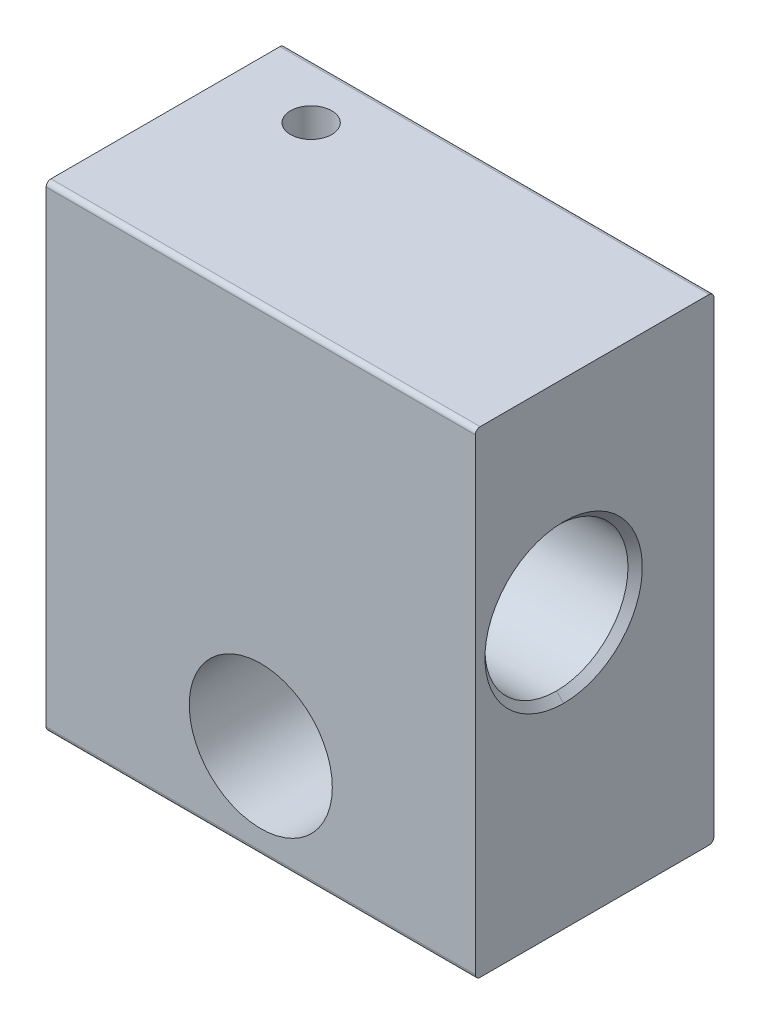
ISO-10303-21;
HEADER;
FILE_DESCRIPTION(('STEP AP214'),'2;1');
FILE_NAME('part.step','',(''),(''),'','','');
FILE_SCHEMA(('AUTOMOTIVE_DESIGN { 1 0 10303 214 1 1 1 1 }'));
ENDSEC;
DATA;
#1=APPLICATION_CONTEXT('core data for automotive mechanical design processes');
#2=APPLICATION_PROTOCOL_DEFINITION('international standard','automotive_design',2000,#1);
#3=PRODUCT_CONTEXT('',#1,'mechanical');
#4=PRODUCT('Part','Part','',(#3));
#5=PRODUCT_RELATED_PRODUCT_CATEGORY('part','',(#4));
#6=PRODUCT_DEFINITION_FORMATION('','',#4);
#7=PRODUCT_DEFINITION_CONTEXT('part definition',#1,'design');
#8=PRODUCT_DEFINITION('design','',#6,#7);
#9=PRODUCT_DEFINITION_SHAPE('','',#8);
#10=(LENGTH_UNIT() NAMED_UNIT(*) SI_UNIT(.MILLI.,.METRE.));
#11=(NAMED_UNIT(*) PLANE_ANGLE_UNIT() SI_UNIT($,.RADIAN.));
#12=(NAMED_UNIT(*) SI_UNIT($,.STERADIAN.) SOLID_ANGLE_UNIT());
#13=UNCERTAINTY_MEASURE_WITH_UNIT(LENGTH_MEASURE(1.E-05),#10,'distance_accuracy_value','');
#14=(GEOMETRIC_REPRESENTATION_CONTEXT(3) GLOBAL_UNCERTAINTY_ASSIGNED_CONTEXT((#13)) GLOBAL_UNIT_ASSIGNED_CONTEXT((#10,
#11,#12)) REPRESENTATION_CONTEXT('',''));
#15=CARTESIAN_POINT('',(0.,0.,0.));
#16=DIRECTION('',(0.,0.,1.));
#17=DIRECTION('',(1.,0.,0.));
#18=AXIS2_PLACEMENT_3D('',#15,#16,#17);
#19=CARTESIAN_POINT('',(0.,0.,0.));
#20=DIRECTION('',(-1.,0.,0.));
#21=DIRECTION('',(0.,0.,1.));
#22=AXIS2_PLACEMENT_3D('',#19,#20,#21);
#23=PLANE('',#22);
#24=CARTESIAN_POINT('',(0.,4.75,-2.75));
#25=DIRECTION('',(-1.,0.,0.));
#26=DIRECTION('',(0.,0.,1.));
#27=AXIS2_PLACEMENT_3D('',#24,#25,#26);
#28=CIRCLE('',#27,1.75);
#29=CARTESIAN_POINT('',(0.,4.75,-1.));
#30=VERTEX_POINT('',#29);
#31=EDGE_CURVE('E27',#30,#30,#28,.T.);
#32=ORIENTED_EDGE('',*,*,#31,.T.);
#33=EDGE_LOOP('',(#32));
#34=FACE_BOUND('',#33,.T.);
#35=ADVANCED_FACE('F24',(#34),#23,.T.);
#36=CARTESIAN_POINT('',(-5.58374404907,8.5,-2.69599699974));
#37=DIRECTION('',(0.,1.,0.));
#38=DIRECTION('',(0.,0.,1.));
#39=AXIS2_PLACEMENT_3D('',#36,#37,#38);
#40=CYLINDRICAL_SURFACE('',#39,0.865463381036);
#41=CARTESIAN_POINT('',(-5.58374404907,10.,-2.69599699974));
#42=DIRECTION('',(0.,1.,0.));
#43=DIRECTION('',(0.,0.,1.));
#44=AXIS2_PLACEMENT_3D('',#41,#42,#43);
#45=CIRCLE('',#44,0.865463381036);
#46=CARTESIAN_POINT('',(-5.58374404907,10.,-1.830533618704));
#47=VERTEX_POINT('',#46);
#48=EDGE_CURVE('E315',#47,#47,#45,.F.);
#49=ORIENTED_EDGE('',*,*,#48,.F.);
#50=EDGE_LOOP('',(#49));
#51=FACE_BOUND('',#50,.T.);
#52=CARTESIAN_POINT('',(-6.449207430106,6.49916656610024,-2.69599699973999));
#53=CARTESIAN_POINT('',(-6.4492086873096,6.49972354637153,-2.71400541937037));
#54=CARTESIAN_POINT('',(-6.44864705794048,6.50000139105537,-2.73201531789425));
#55=CARTESIAN_POINT('',(-6.44465669121742,6.49999646183324,-2.79574426413716));
#56=CARTESIAN_POINT('',(-6.43814057995364,6.49818642035229,-2.84132539176675));
#57=CARTESIAN_POINT('',(-6.4180382537288,6.49122571648187,-2.93070952830053));
#58=CARTESIAN_POINT('',(-6.40443358886115,6.48606632783735,-2.97450757396934));
#59=CARTESIAN_POINT('',(-6.37075997097261,6.47305113628228,-3.05888384176469));
#60=CARTESIAN_POINT('',(-6.35071841834362,6.46520675365258,-3.09947481905903));
#61=CARTESIAN_POINT('',(-6.3048151199277,6.44763759692892,-3.17672968859697));
#62=CARTESIAN_POINT('',(-6.27895486317882,6.43791330400374,-3.21339458201017));
#63=CARTESIAN_POINT('',(-6.2203272749571,6.41689392028393,-3.28423923717417));
#64=CARTESIAN_POINT('',(-6.18723607882171,6.40553932282132,-3.31813326780307));
#65=CARTESIAN_POINT('',(-6.11593727697109,6.38295228004643,-3.38012504391386));
#66=CARTESIAN_POINT('',(-6.07772629947583,6.37171992055383,-3.40821893830059));
#67=CARTESIAN_POINT('',(-5.99463932902142,6.35004468851422,-3.45934652718211));
#68=CARTESIAN_POINT('',(-5.94950847478227,6.3396825131614,-3.48200369915722));
#69=CARTESIAN_POINT('',(-5.85548109889723,6.32200273379749,-3.51924457908662));
#70=CARTESIAN_POINT('',(-5.80658803205411,6.31468237514228,-3.53383559565921));
#71=CARTESIAN_POINT('',(-5.71015822828295,6.30467761091631,-3.55348721920538));
#72=CARTESIAN_POINT('',(-5.66277773086278,6.30169709245857,-3.55915894210042));
#73=CARTESIAN_POINT('',(-5.56766096640759,6.29989018264465,-3.56261674312619));
#74=CARTESIAN_POINT('',(-5.51992488675015,6.30106173920841,-3.56040671665055));
#75=CARTESIAN_POINT('',(-5.42986568744132,6.30707872647427,-3.5487744480056));
#76=CARTESIAN_POINT('',(-5.38743385549059,6.31159446122974,-3.53999874988904));
#77=CARTESIAN_POINT('',(-5.30469374898141,6.32332492258392,-3.51636896284278));
#78=CARTESIAN_POINT('',(-5.26438613360283,6.33054048142203,-3.50151299949669));
#79=CARTESIAN_POINT('',(-5.18478837876821,6.34725486800054,-3.46532627941122));
#80=CARTESIAN_POINT('',(-5.14564892915387,6.35684952476926,-3.4437098667129));
#81=CARTESIAN_POINT('',(-5.07132571551039,6.37706212279255,-3.3948772448417));
#82=CARTESIAN_POINT('',(-5.03614366297519,6.38768050312814,-3.36765862711932));
#83=CARTESIAN_POINT('',(-4.9669215117072,6.41000786574007,-3.3050569640343));
#84=CARTESIAN_POINT('',(-4.93337998149943,6.42171551782124,-3.2691194291736));
#85=CARTESIAN_POINT('',(-4.87267220418854,6.44379120867714,-3.19179912856174));
#86=CARTESIAN_POINT('',(-4.84550965627911,6.45415846859545,-3.1504132248832));
#87=CARTESIAN_POINT('',(-4.79838903557011,6.47235511410542,-3.06303241331348));
#88=CARTESIAN_POINT('',(-4.7784520308393,6.48017707149831,-3.01702451902662));
#89=CARTESIAN_POINT('',(-4.74679327213,6.49219025016628,-2.92191200474589));
#90=CARTESIAN_POINT('',(-4.7350468363424,6.4963923886467,-2.87281717881534));
#91=CARTESIAN_POINT('',(-4.72406027310477,6.49948830911025,-2.79882395768014));
#92=CARTESIAN_POINT('',(-4.72149554021143,6.49999977476995,-2.77444274951363));
#93=CARTESIAN_POINT('',(-4.71884295055461,6.50000016566553,-2.73202139985759));
#94=CARTESIAN_POINT('',(-4.71827943330949,6.49972374110849,-2.71400950474476));
#95=CARTESIAN_POINT('',(-4.71828381562203,6.49774620279394,-2.65007910897877));
#96=CARTESIAN_POINT('',(-4.72195702508557,6.49450137214108,-2.60415725481187));
#97=CARTESIAN_POINT('',(-4.73644015740359,6.48458127484062,-2.51376423916476));
#98=CARTESIAN_POINT('',(-4.74726808507634,6.47789736317569,-2.46929703536373));
#99=CARTESIAN_POINT('',(-4.77548993597744,6.46170199844034,-2.38328017681597));
#100=CARTESIAN_POINT('',(-4.79285501221056,6.45220300632357,-2.34171864176206));
#101=CARTESIAN_POINT('',(-4.83350841155483,6.43114763987285,-2.26221305522438));
#102=CARTESIAN_POINT('',(-4.85679511155554,6.41959182957048,-2.22426801637502));
#103=CARTESIAN_POINT('',(-4.91039960167581,6.39450766537549,-2.15023171531711));
#104=CARTESIAN_POINT('',(-4.94108228062547,6.380899206744,-2.11443206004765));
#105=CARTESIAN_POINT('',(-5.00782665576707,6.35354346777814,-2.04826446271212));
#106=CARTESIAN_POINT('',(-5.04389314897671,6.33979607394053,-2.01790141831863));
#107=CARTESIAN_POINT('',(-5.12366652363538,6.31248490389022,-1.96120088078699));
#108=CARTESIAN_POINT('',(-5.16774344408427,6.29901211133435,-1.93533564998294));
#109=CARTESIAN_POINT('',(-5.26045629542931,6.27518576666964,-1.89155126372133));
#110=CARTESIAN_POINT('',(-5.3090877619739,6.26482920114828,-1.87362442382016));
#111=CARTESIAN_POINT('',(-5.40572708885063,6.24950919654306,-1.84767804862572));
#112=CARTESIAN_POINT('',(-5.45350314083801,6.24419665695144,-1.83901090447264));
#113=CARTESIAN_POINT('',(-5.55010384436479,6.23856429273418,-1.82983178166885));
#114=CARTESIAN_POINT('',(-5.59892733496616,6.23823920025186,-1.82931119842093));
#115=CARTESIAN_POINT('',(-5.68934206548476,6.24232890622555,-1.83596382915768));
#116=CARTESIAN_POINT('',(-5.73104107267388,6.24612685707844,-1.84213565272858));
#117=CARTESIAN_POINT('',(-5.8126974348522,6.25700997842461,-1.86031903512794));
#118=CARTESIAN_POINT('',(-5.85265416760186,6.26409631298763,-1.87233266199479));
#119=CARTESIAN_POINT('',(-5.93113878099246,6.2810079361542,-1.9021702391697));
#120=CARTESIAN_POINT('',(-5.96958678335483,6.29090964927711,-1.92015908088539));
#121=CARTESIAN_POINT('',(-6.04310844083208,6.31236402099279,-1.96129449500525));
#122=CARTESIAN_POINT('',(-6.07818061432558,6.32391739900807,-1.98444331743356));
#123=CARTESIAN_POINT('',(-6.14916349491693,6.3493909397552,-2.03903051276998));
#124=CARTESIAN_POINT('',(-6.18449365286089,6.36341497727178,-2.07117778407229));
#125=CARTESIAN_POINT('',(-6.24950164826755,6.39102876469068,-2.14095734186772));
#126=CARTESIAN_POINT('',(-6.27917547390777,6.40461820070326,-2.17859348826337));
#127=CARTESIAN_POINT('',(-6.33367308009541,6.43088241104561,-2.26100960973501));
#128=CARTESIAN_POINT('',(-6.35811108851098,6.44345702275217,-2.30607886074583));
#129=CARTESIAN_POINT('',(-6.39880228118033,6.46541898184203,-2.40047017795097));
#130=CARTESIAN_POINT('',(-6.41506809904862,6.47481124154549,-2.44978554083436));
#131=CARTESIAN_POINT('',(-6.43421838383054,6.48670749743439,-2.53229912888511));
#132=CARTESIAN_POINT('',(-6.4398271574966,6.49047435088954,-2.56470946175158));
#133=CARTESIAN_POINT('',(-6.44731702408066,6.49619244071428,-2.63007797731129));
#134=CARTESIAN_POINT('',(-6.449205128964,6.49814708867279,-2.66303501120335));
#135=CARTESIAN_POINT('',(-6.449207430106,6.49916656610024,-2.69599699973999));
#136=B_SPLINE_CURVE_WITH_KNOTS('',3,(#52,#53,#54,#55,#56,#57,#58,#59,#60,#61,#62,#63,#64,#65,
#66,#67,#68,#69,#70,#71,#72,#73,#74,#75,#76,#77,#78,#79,#80,#81,#82,#83,#84,#85,#86,#87,#88,#89,
#90,#91,#92,#93,#94,#95,#96,#97,#98,#99,#100,#101,#102,#103,#104,#105,#106,#107,#108,#109,#110,
#111,#112,#113,#114,#115,#116,#117,#118,#119,#120,#121,#122,#123,#124,#125,#126,#127,#128,#129,
#130,#131,#132,#133,#134,#135),.UNSPECIFIED.,.T.,.F.,(4,2,2,2,2,2,2,2,2,2,2,2,2,2,2,2,2,2,2,2,2,
2,2,2,2,2,2,2,2,2,2,2,2,2,2,2,2,2,2,2,2,4),(0.,0.0540357553285561,0.191476375635961,
0.329276523182381,0.466497692359897,0.60368378575125,0.74919296440193,0.894798447722468,
1.04864722853286,1.20235637990724,1.3449867549427,1.48754664759974,1.61765966625642,
1.7478128262369,1.88444903710158,2.02114411498192,2.17204378232469,2.32303074200388,
2.47445446976672,2.6254198954768,2.69888403738886,2.75291979271804,2.89066897917203,
3.0287661378322,3.16626091463035,3.30371804481079,3.45032659432867,3.59706656158034,
3.75480439493193,3.91238920086785,4.05803704839619,4.20353104870417,4.3299184228481,
4.45635057159712,4.58661033582154,4.71692701168544,4.86564009999022,5.01445827556282,
5.17199113310592,5.3292797010853,5.42837180708747,5.52727698501349),.UNSPECIFIED.);
#137=CARTESIAN_POINT('',(-6.449207430106,6.49916656610024,-2.69599699973999));
#138=VERTEX_POINT('',#137);
#139=EDGE_CURVE('E351',#138,#138,#136,.T.);
#140=ORIENTED_EDGE('',*,*,#139,.T.);
#141=EDGE_LOOP('',(#140));
#142=FACE_BOUND('',#141,.T.);
#143=ADVANCED_FACE('F357',(#51,#142),#40,.F.);
#144=CARTESIAN_POINT('',(-4.5,4.75,-2.75));
#145=DIRECTION('',(-1.,0.,0.));
#146=DIRECTION('',(0.,0.,1.));
#147=AXIS2_PLACEMENT_3D('',#144,#145,#146);
#148=CYLINDRICAL_SURFACE('',#147,1.75);
#149=ORIENTED_EDGE('',*,*,#31,.F.);
#150=EDGE_LOOP('',(#149));
#151=FACE_BOUND('',#150,.T.);
#152=CARTESIAN_POINT('',(-8.80000000006476,4.75,-2.74999999999999));
#153=DIRECTION('',(-1.,0.,0.));
#154=DIRECTION('',(0.,-1.,0.));
#155=AXIS2_PLACEMENT_3D('',#152,#153,#154);
#156=CIRCLE('',#155,1.74999999995725);
#157=CARTESIAN_POINT('',(-8.80000000003436,6.49999999996908,-2.75));
#158=VERTEX_POINT('',#157);
#159=CARTESIAN_POINT('',(-8.80000000003436,3.0000000000316,-2.75));
#160=VERTEX_POINT('',#159);
#161=EDGE_CURVE('E150',#158,#160,#156,.T.);
#162=ORIENTED_EDGE('',*,*,#161,.T.);
#163=CARTESIAN_POINT('',(-8.80000000000791,4.75,-2.75));
#164=DIRECTION('',(-1.,0.,0.));
#165=DIRECTION('',(0.,0.50000000000065,-0.866025403784064));
#166=AXIS2_PLACEMENT_3D('',#163,#164,#165);
#167=CIRCLE('',#166,1.74999999995907);
#168=EDGE_CURVE('E141',#160,#158,#167,.T.);
#169=ORIENTED_EDGE('',*,*,#168,.T.);
#170=EDGE_LOOP('',(#162,#169));
#171=FACE_BOUND('',#170,.T.);
#172=ORIENTED_EDGE('',*,*,#139,.F.);
#173=EDGE_LOOP('',(#172));
#174=FACE_BOUND('',#173,.T.);
#175=ADVANCED_FACE('F158',(#151,#171,#174),#148,.F.);
#176=CARTESIAN_POINT('',(-1.5,1.5,1.3));
#177=DIRECTION('',(1.,0.,0.));
#178=DIRECTION('',(0.,0.,-1.));
#179=AXIS2_PLACEMENT_3D('',#176,#177,#178);
#180=CYLINDRICAL_SURFACE('',#179,3.);
#181=CARTESIAN_POINT('',(-8.70000000003302,1.49999999999999,1.3));
#182=DIRECTION('',(-1.,0.,0.));
#183=DIRECTION('',(0.,-0.4999999999965,0.86602540378646));
#184=AXIS2_PLACEMENT_3D('',#181,#182,#183);
#185=CIRCLE('',#184,2.99999999996414);
#186=CARTESIAN_POINT('',(-8.7000000000117,4.49999999999467,1.29999999998857));
#187=VERTEX_POINT('',#186);
#188=CARTESIAN_POINT('',(-8.70000000003897,-1.50000000001241,1.2999999999998));
#189=VERTEX_POINT('',#188);
#190=EDGE_CURVE('E296',#187,#189,#185,.T.);
#191=ORIENTED_EDGE('',*,*,#190,.T.);
#192=CARTESIAN_POINT('',(-8.70000000003302,1.5,1.3));
#193=DIRECTION('',(-1.,0.,0.));
#194=DIRECTION('',(0.,1.,0.));
#195=AXIS2_PLACEMENT_3D('',#192,#193,#194);
#196=CIRCLE('',#195,3.00000000000727);
#197=EDGE_CURVE('E124',#189,#187,#196,.T.);
#198=ORIENTED_EDGE('',*,*,#197,.T.);
#199=EDGE_LOOP('',(#191,#198));
#200=FACE_BOUND('',#199,.T.);
#201=CARTESIAN_POINT('',(8.70000000003302,1.49999999999999,1.3));
#202=DIRECTION('',(1.,0.,0.));
#203=DIRECTION('',(0.,-0.4999999999965,0.86602540378646));
#204=AXIS2_PLACEMENT_3D('',#201,#202,#203);
#205=CIRCLE('',#204,2.99999999996414);
#206=CARTESIAN_POINT('',(8.70000000003897,-1.50000000002662,1.30000000000303));
#207=VERTEX_POINT('',#206);
#208=CARTESIAN_POINT('',(8.69999999999634,4.49999999998046,1.3));
#209=VERTEX_POINT('',#208);
#210=EDGE_CURVE('E166',#207,#209,#205,.T.);
#211=ORIENTED_EDGE('',*,*,#210,.T.);
#212=CARTESIAN_POINT('',(8.70000000003302,1.5,1.3));
#213=DIRECTION('',(1.,0.,0.));
#214=DIRECTION('',(0.,1.,0.));
#215=AXIS2_PLACEMENT_3D('',#212,#213,#214);
#216=CIRCLE('',#215,3.00000000000727);
#217=EDGE_CURVE('E169',#209,#207,#216,.T.);
#218=ORIENTED_EDGE('',*,*,#217,.T.);
#219=EDGE_LOOP('',(#211,#218));
#220=FACE_BOUND('',#219,.T.);
#221=ADVANCED_FACE('F335',(#200,#220),#180,.F.);
#222=CARTESIAN_POINT('',(0.,9.8,4.8));
#223=DIRECTION('',(1.,0.,0.));
#224=DIRECTION('',(0.,0.,-1.));
#225=AXIS2_PLACEMENT_3D('',#222,#223,#224);
#226=CYLINDRICAL_SURFACE('',#225,0.2);
#227=CARTESIAN_POINT('',(-9.,9.8,4.8));
#228=DIRECTION('',(1.,0.,0.));
#229=DIRECTION('',(0.,0.,-1.));
#230=AXIS2_PLACEMENT_3D('',#227,#228,#229);
#231=CIRCLE('',#230,0.2);
#232=CARTESIAN_POINT('',(-9.,10.,4.8));
#233=VERTEX_POINT('',#232);
#234=CARTESIAN_POINT('',(-9.,9.8,5.));
#235=VERTEX_POINT('',#234);
#236=EDGE_CURVE('E349',#233,#235,#231,.T.);
#237=ORIENTED_EDGE('',*,*,#236,.T.);
#238=DIRECTION('',(-1.,0.,0.));
#239=VECTOR('',#238,1.);
#240=CARTESIAN_POINT('',(0.,9.8,5.));
#241=LINE('',#240,#239);
#242=CARTESIAN_POINT('',(9.,9.8,5.));
#243=VERTEX_POINT('',#242);
#244=EDGE_CURVE('E284',#235,#243,#241,.F.);
#245=ORIENTED_EDGE('',*,*,#244,.T.);
#246=CARTESIAN_POINT('',(9.,9.8,4.8));
#247=DIRECTION('',(1.,0.,0.));
#248=DIRECTION('',(0.,0.,-1.));
#249=AXIS2_PLACEMENT_3D('',#246,#247,#248);
#250=CIRCLE('',#249,0.2);
#251=CARTESIAN_POINT('',(9.,10.,4.8));
#252=VERTEX_POINT('',#251);
#253=EDGE_CURVE('E112',#243,#252,#250,.F.);
#254=ORIENTED_EDGE('',*,*,#253,.T.);
#255=DIRECTION('',(1.,0.,0.));
#256=VECTOR('',#255,1.);
#257=CARTESIAN_POINT('',(0.,10.,4.8));
#258=LINE('',#257,#256);
#259=EDGE_CURVE('E313',#233,#252,#258,.T.);
#260=ORIENTED_EDGE('',*,*,#259,.F.);
#261=EDGE_LOOP('',(#237,#245,#254,#260));
#262=FACE_BOUND('',#261,.T.);
#263=ADVANCED_FACE('F365',(#262),#226,.T.);
#264=CARTESIAN_POINT('',(0.,-9.8,4.8));
#265=DIRECTION('',(1.,0.,0.));
#266=DIRECTION('',(0.,0.,-1.));
#267=AXIS2_PLACEMENT_3D('',#264,#265,#266);
#268=CYLINDRICAL_SURFACE('',#267,0.2);
#269=CARTESIAN_POINT('',(-9.,-9.8,4.8));
#270=DIRECTION('',(1.,0.,0.));
#271=DIRECTION('',(0.,0.,-1.));
#272=AXIS2_PLACEMENT_3D('',#269,#270,#271);
#273=CIRCLE('',#272,0.2);
#274=CARTESIAN_POINT('',(-9.,-9.8,5.));
#275=VERTEX_POINT('',#274);
#276=CARTESIAN_POINT('',(-9.,-10.,4.8));
#277=VERTEX_POINT('',#276);
#278=EDGE_CURVE('E170',#275,#277,#273,.T.);
#279=ORIENTED_EDGE('',*,*,#278,.T.);
#280=DIRECTION('',(1.,0.,0.));
#281=VECTOR('',#280,1.);
#282=CARTESIAN_POINT('',(0.,-10.,4.8));
#283=LINE('',#282,#281);
#284=CARTESIAN_POINT('',(9.,-10.,4.8));
#285=VERTEX_POINT('',#284);
#286=EDGE_CURVE('E301',#285,#277,#283,.F.);
#287=ORIENTED_EDGE('',*,*,#286,.F.);
#288=CARTESIAN_POINT('',(9.,-9.8,4.8));
#289=DIRECTION('',(1.,0.,0.));
#290=DIRECTION('',(0.,0.,-1.));
#291=AXIS2_PLACEMENT_3D('',#288,#289,#290);
#292=CIRCLE('',#291,0.2);
#293=CARTESIAN_POINT('',(9.,-9.8,5.));
#294=VERTEX_POINT('',#293);
#295=EDGE_CURVE('E347',#285,#294,#292,.F.);
#296=ORIENTED_EDGE('',*,*,#295,.T.);
#297=DIRECTION('',(-1.,0.,0.));
#298=VECTOR('',#297,1.);
#299=CARTESIAN_POINT('',(0.,-9.8,5.));
#300=LINE('',#299,#298);
#301=EDGE_CURVE('E287',#294,#275,#300,.T.);
#302=ORIENTED_EDGE('',*,*,#301,.T.);
#303=EDGE_LOOP('',(#279,#287,#296,#302));
#304=FACE_BOUND('',#303,.T.);
#305=ADVANCED_FACE('F368',(#304),#268,.T.);
#306=CARTESIAN_POINT('',(9.00000000012824,1.49999999999999,1.29999999999999));
#307=DIRECTION('',(1.,0.,0.));
#308=DIRECTION('',(0.,1.,0.));
#309=AXIS2_PLACEMENT_3D('',#306,#307,#308);
#310=CONICAL_SURFACE('',#309,3.30000000011194,0.785398163401328);
#311=CARTESIAN_POINT('',(9.00000000004058,1.49999999999999,1.29999999999999));
#312=DIRECTION('',(1.,0.,0.));
#313=DIRECTION('',(0.,1.,0.));
#314=AXIS2_PLACEMENT_3D('',#311,#312,#313);
#315=CIRCLE('',#314,3.30000000002428);
#316=CARTESIAN_POINT('',(9.00000000004297,4.80000000000655,1.3));
#317=VERTEX_POINT('',#316);
#318=CARTESIAN_POINT('',(9.00000000008441,-1.80000000010955,1.30000000000593));
#319=VERTEX_POINT('',#318);
#320=EDGE_CURVE('E210',#317,#319,#315,.F.);
#321=ORIENTED_EDGE('',*,*,#320,.F.);
#322=DIRECTION('',(-0.707106781186863,-0.707106781186232,0.));
#323=VECTOR('',#322,1.);
#324=CARTESIAN_POINT('',(499000.,498995.799999554,1.29999999935079));
#325=LINE('',#324,#323);
#326=EDGE_CURVE('E316',#317,#209,#325,.T.);
#327=ORIENTED_EDGE('',*,*,#326,.T.);
#328=ORIENTED_EDGE('',*,*,#210,.F.);
#329=DIRECTION('',(-0.707106781186866,0.70710678118623,0.));
#330=VECTOR('',#329,1.);
#331=CARTESIAN_POINT('',(499000.000000001,-498992.799999553,1.2999999998978));
#332=LINE('',#331,#330);
#333=EDGE_CURVE('E175',#207,#319,#332,.F.);
#334=ORIENTED_EDGE('',*,*,#333,.T.);
#335=EDGE_LOOP('',(#321,#327,#328,#334));
#336=FACE_BOUND('',#335,.T.);
#337=ADVANCED_FACE('F371',(#336),#310,.F.);
#338=CARTESIAN_POINT('',(9.00000000001456,1.50000000000001,1.3));
#339=DIRECTION('',(1.,0.,0.));
#340=DIRECTION('',(0.,0.,-1.));
#341=AXIS2_PLACEMENT_3D('',#338,#339,#340);
#342=CONICAL_SURFACE('',#341,3.29999999998881,0.785398163302706);
#343=CARTESIAN_POINT('',(9.0000000000714,1.50000000000001,1.3));
#344=DIRECTION('',(1.,0.,0.));
#345=DIRECTION('',(0.,0.,-1.));
#346=AXIS2_PLACEMENT_3D('',#343,#344,#345);
#347=CIRCLE('',#346,3.30000000004565);
#348=EDGE_CURVE('E207',#319,#317,#347,.F.);
#349=ORIENTED_EDGE('',*,*,#348,.F.);
#350=ORIENTED_EDGE('',*,*,#333,.F.);
#351=ORIENTED_EDGE('',*,*,#217,.F.);
#352=ORIENTED_EDGE('',*,*,#326,.F.);
#353=EDGE_LOOP('',(#349,#350,#351,#352));
#354=FACE_BOUND('',#353,.T.);
#355=ADVANCED_FACE('F375',(#354),#342,.F.);
#356=CARTESIAN_POINT('',(0.,10.,-5.));
#357=DIRECTION('',(0.,1.,0.));
#358=DIRECTION('',(0.,0.,1.));
#359=AXIS2_PLACEMENT_3D('',#356,#357,#358);
#360=PLANE('',#359);
#361=ORIENTED_EDGE('',*,*,#48,.T.);
#362=EDGE_LOOP('',(#361));
#363=FACE_BOUND('',#362,.T.);
#364=DIRECTION('',(0.,0.,-1.));
#365=VECTOR('',#364,1.);
#366=CARTESIAN_POINT('',(9.,10.,0.));
#367=LINE('',#366,#365);
#368=CARTESIAN_POINT('',(9.,10.,-4.8));
#369=VERTEX_POINT('',#368);
#370=EDGE_CURVE('E288',#369,#252,#367,.F.);
#371=ORIENTED_EDGE('',*,*,#370,.F.);
#372=DIRECTION('',(1.,0.,0.));
#373=VECTOR('',#372,1.);
#374=CARTESIAN_POINT('',(0.,10.,-4.8));
#375=LINE('',#374,#373);
#376=CARTESIAN_POINT('',(-9.,10.,-4.8));
#377=VERTEX_POINT('',#376);
#378=EDGE_CURVE('E204',#377,#369,#375,.T.);
#379=ORIENTED_EDGE('',*,*,#378,.F.);
#380=DIRECTION('',(0.,0.,-1.));
#381=VECTOR('',#380,1.);
#382=CARTESIAN_POINT('',(-9.,10.,0.));
#383=LINE('',#382,#381);
#384=EDGE_CURVE('E203',#377,#233,#383,.F.);
#385=ORIENTED_EDGE('',*,*,#384,.T.);
#386=ORIENTED_EDGE('',*,*,#259,.T.);
#387=EDGE_LOOP('',(#371,#379,#385,#386));
#388=FACE_BOUND('',#387,.T.);
#389=ADVANCED_FACE('F242',(#363,#388),#360,.T.);
#390=CARTESIAN_POINT('',(-9.0000000000714,4.75,-2.75));
#391=DIRECTION('',(-1.,0.,0.));
#392=DIRECTION('',(0.,0.,1.));
#393=AXIS2_PLACEMENT_3D('',#390,#391,#392);
#394=CONICAL_SURFACE('',#393,1.94999999998469,0.785398163302793);
#395=DIRECTION('',(0.707106781186865,-0.70710678118623,0.));
#396=VECTOR('',#395,1.);
#397=CARTESIAN_POINT('',(-499000.,498997.699999552,-2.74999999989215));
#398=LINE('',#397,#396);
#399=CARTESIAN_POINT('',(-9.0000000001005,6.70000000005052,-2.75));
#400=VERTEX_POINT('',#399);
#401=EDGE_CURVE('E147',#400,#158,#398,.T.);
#402=ORIENTED_EDGE('',*,*,#401,.T.);
#403=ORIENTED_EDGE('',*,*,#168,.F.);
#404=DIRECTION('',(0.707106781186865,0.70710678118623,0.));
#405=VECTOR('',#404,1.);
#406=CARTESIAN_POINT('',(-499000.,-498988.199999552,-2.74999999805237));
#407=LINE('',#406,#405);
#408=CARTESIAN_POINT('',(-9.0000000001005,2.79999999996818,-2.75));
#409=VERTEX_POINT('',#408);
#410=EDGE_CURVE('E144',#160,#409,#407,.F.);
#411=ORIENTED_EDGE('',*,*,#410,.T.);
#412=CARTESIAN_POINT('',(-9.0000000000714,4.75,-2.75));
#413=DIRECTION('',(-1.,0.,0.));
#414=DIRECTION('',(0.,0.,1.));
#415=AXIS2_PLACEMENT_3D('',#412,#413,#414);
#416=CIRCLE('',#415,1.94999999998469);
#417=CARTESIAN_POINT('',(-9.00000000008667,3.26104594027713,-1.49082733194566));
#418=VERTEX_POINT('',#417);
#419=EDGE_CURVE('E151',#418,#409,#416,.F.);
#420=ORIENTED_EDGE('',*,*,#419,.F.);
#421=CARTESIAN_POINT('',(-9.00000000005173,3.26104594041933,-1.49082733180797));
#422=CARTESIAN_POINT('',(-8.99053315917735,3.30776563824762,-1.45018060264174));
#423=CARTESIAN_POINT('',(-8.98336596612363,3.35516243045166,-1.4097570754099));
#424=CARTESIAN_POINT('',(-8.97380993799945,3.45073318744524,-1.3298791499277));
#425=CARTESIAN_POINT('',(-8.97139172704236,3.49890050438715,-1.29042029440767));
#426=CARTESIAN_POINT('',(-8.97139172704234,3.5960220769384,-1.21248323001468));
#427=CARTESIAN_POINT('',(-8.97380993799941,3.64497633254773,-1.17400502114173));
#428=CARTESIAN_POINT('',(-8.98336596612355,3.74365682982795,-1.09800231047828));
#429=CARTESIAN_POINT('',(-8.99053315917725,3.7933859832064,-1.06048526409454));
#430=CARTESIAN_POINT('',(-9.00000000005161,3.84318639784086,-1.02367758202522));
#431=B_SPLINE_CURVE_WITH_KNOTS('',3,(#421,#422,#423,#424,#425,#426,#427,#428,#429,#430),
.UNSPECIFIED.,.F.,.F.,(4,2,2,2,4),(0.,0.187911721686846,0.374657365917431,0.561403010148015,
0.749314731834862),.UNSPECIFIED.);
#432=CARTESIAN_POINT('',(-9.00000000004816,3.84318639778785,-1.02367758204238));
#433=VERTEX_POINT('',#432);
#434=EDGE_CURVE('E213',#418,#433,#431,.T.);
#435=ORIENTED_EDGE('',*,*,#434,.T.);
#436=CARTESIAN_POINT('',(-9.0000000000714,4.75,-2.75));
#437=DIRECTION('',(-1.,0.,0.));
#438=DIRECTION('',(0.,0.,1.));
#439=AXIS2_PLACEMENT_3D('',#436,#437,#438);
#440=CIRCLE('',#439,1.94999999998469);
#441=EDGE_CURVE('E197',#433,#400,#440,.T.);
#442=ORIENTED_EDGE('',*,*,#441,.T.);
#443=EDGE_LOOP('',(#402,#403,#411,#420,#435,#442));
#444=FACE_BOUND('',#443,.T.);
#445=ADVANCED_FACE('F143',(#444),#394,.F.);
#446=CARTESIAN_POINT('',(-9.00000000001455,4.75,-2.74999999999999));
#447=DIRECTION('',(-1.,0.,0.));
#448=DIRECTION('',(0.,0.,1.));
#449=AXIS2_PLACEMENT_3D('',#446,#447,#448);
#450=CONICAL_SURFACE('',#449,1.94999999990705,0.785398163397448);
#451=CARTESIAN_POINT('',(-9.0000000001296,4.75,-2.74999999999999));
#452=DIRECTION('',(-1.,0.,0.));
#453=DIRECTION('',(0.,0.,1.));
#454=AXIS2_PLACEMENT_3D('',#451,#452,#453);
#455=CIRCLE('',#454,1.9500000000221);
#456=EDGE_CURVE('E156',#400,#409,#455,.T.);
#457=ORIENTED_EDGE('',*,*,#456,.T.);
#458=ORIENTED_EDGE('',*,*,#410,.F.);
#459=ORIENTED_EDGE('',*,*,#161,.F.);
#460=ORIENTED_EDGE('',*,*,#401,.F.);
#461=EDGE_LOOP('',(#457,#458,#459,#460));
#462=FACE_BOUND('',#461,.T.);
#463=ADVANCED_FACE('F154',(#462),#450,.F.);
#464=CARTESIAN_POINT('',(-9.00000000001456,1.50000000000001,1.3));
#465=DIRECTION('',(-1.,0.,0.));
#466=DIRECTION('',(0.,0.,1.));
#467=AXIS2_PLACEMENT_3D('',#464,#465,#466);
#468=CONICAL_SURFACE('',#467,3.29999999998881,0.785398163302706);
#469=ORIENTED_EDGE('',*,*,#197,.F.);
#470=DIRECTION('',(0.707106781186862,0.707106781186233,3.01303426653021E-12));
#471=VECTOR('',#470,1.);
#472=CARTESIAN_POINT('',(-498999.999999998,-498992.799999555,1.29999787376092));
#473=LINE('',#472,#471);
#474=CARTESIAN_POINT('',(-9.00000000011284,-1.80000000012024,1.29999999999923));
#475=VERTEX_POINT('',#474);
#476=EDGE_CURVE('E299',#189,#475,#473,.F.);
#477=ORIENTED_EDGE('',*,*,#476,.T.);
#478=CARTESIAN_POINT('',(-9.00000000001456,1.50000000000001,1.3));
#479=DIRECTION('',(-1.,0.,0.));
#480=DIRECTION('',(0.,0.,1.));
#481=AXIS2_PLACEMENT_3D('',#478,#479,#480);
#482=CIRCLE('',#481,3.29999999998881);
#483=CARTESIAN_POINT('',(-8.99999999997295,4.79999999997624,1.2999999999774));
#484=VERTEX_POINT('',#483);
#485=EDGE_CURVE('E190',#475,#484,#482,.T.);
#486=ORIENTED_EDGE('',*,*,#485,.T.);
#487=DIRECTION('',(0.707106781186867,-0.707106781186228,-5.93913807023227E-13));
#488=VECTOR('',#487,1.);
#489=CARTESIAN_POINT('',(-499000.000000002,498995.799999551,1.3000004190904));
#490=LINE('',#489,#488);
#491=EDGE_CURVE('E222',#484,#187,#490,.T.);
#492=ORIENTED_EDGE('',*,*,#491,.T.);
#493=EDGE_LOOP('',(#469,#477,#486,#492));
#494=FACE_BOUND('',#493,.T.);
#495=ADVANCED_FACE('F233',(#494),#468,.F.);
#496=CARTESIAN_POINT('',(-9.00000000012824,1.49999999999999,1.29999999999999));
#497=DIRECTION('',(-1.,0.,0.));
#498=DIRECTION('',(0.,-1.,0.));
#499=AXIS2_PLACEMENT_3D('',#496,#497,#498);
#500=CONICAL_SURFACE('',#499,3.30000000011194,0.785398163401325);
#501=ORIENTED_EDGE('',*,*,#476,.F.);
#502=ORIENTED_EDGE('',*,*,#190,.F.);
#503=ORIENTED_EDGE('',*,*,#491,.F.);
#504=CARTESIAN_POINT('',(-9.00000000000136,1.49999999999999,1.29999999999999));
#505=DIRECTION('',(-1.,0.,0.));
#506=DIRECTION('',(0.,-1.,0.));
#507=AXIS2_PLACEMENT_3D('',#504,#505,#506);
#508=CIRCLE('',#507,3.29999999998506);
#509=EDGE_CURVE('E187',#484,#433,#508,.T.);
#510=ORIENTED_EDGE('',*,*,#509,.T.);
#511=ORIENTED_EDGE('',*,*,#434,.F.);
#512=CARTESIAN_POINT('',(-9.00000000015427,1.49999999999999,1.29999999999999));
#513=DIRECTION('',(-1.,0.,0.));
#514=DIRECTION('',(0.,-1.,0.));
#515=AXIS2_PLACEMENT_3D('',#512,#513,#514);
#516=CIRCLE('',#515,3.30000000013797);
#517=EDGE_CURVE('E193',#418,#475,#516,.T.);
#518=ORIENTED_EDGE('',*,*,#517,.T.);
#519=EDGE_LOOP('',(#501,#502,#503,#510,#511,#518));
#520=FACE_BOUND('',#519,.T.);
#521=ADVANCED_FACE('F227',(#520),#500,.F.);
#522=CARTESIAN_POINT('',(0.,-10.,5.));
#523=DIRECTION('',(0.,-1.,0.));
#524=DIRECTION('',(0.,0.,-1.));
#525=AXIS2_PLACEMENT_3D('',#522,#523,#524);
#526=PLANE('',#525);
#527=DIRECTION('',(0.,0.,-1.));
#528=VECTOR('',#527,1.);
#529=CARTESIAN_POINT('',(-9.,-10.,0.));
#530=LINE('',#529,#528);
#531=CARTESIAN_POINT('',(-9.,-10.,-4.8));
#532=VERTEX_POINT('',#531);
#533=EDGE_CURVE('E199',#277,#532,#530,.T.);
#534=ORIENTED_EDGE('',*,*,#533,.T.);
#535=DIRECTION('',(1.,0.,0.));
#536=VECTOR('',#535,1.);
#537=CARTESIAN_POINT('',(0.,-10.,-4.8));
#538=LINE('',#537,#536);
#539=CARTESIAN_POINT('',(9.,-10.,-4.8));
#540=VERTEX_POINT('',#539);
#541=EDGE_CURVE('E183',#540,#532,#538,.F.);
#542=ORIENTED_EDGE('',*,*,#541,.F.);
#543=DIRECTION('',(0.,0.,-1.));
#544=VECTOR('',#543,1.);
#545=CARTESIAN_POINT('',(9.,-10.,0.));
#546=LINE('',#545,#544);
#547=EDGE_CURVE('E212',#285,#540,#546,.T.);
#548=ORIENTED_EDGE('',*,*,#547,.F.);
#549=ORIENTED_EDGE('',*,*,#286,.T.);
#550=EDGE_LOOP('',(#534,#542,#548,#549));
#551=FACE_BOUND('',#550,.T.);
#552=ADVANCED_FACE('F232',(#551),#526,.T.);
#553=CARTESIAN_POINT('',(0.,-10.,5.));
#554=DIRECTION('',(0.,0.,-1.));
#555=DIRECTION('',(-1.,0.,0.));
#556=AXIS2_PLACEMENT_3D('',#553,#554,#555);
#557=PLANE('',#556);
#558=CARTESIAN_POINT('',(0.,-6.,5.));
#559=DIRECTION('',(0.,0.,1.));
#560=DIRECTION('',(1.,0.,0.));
#561=AXIS2_PLACEMENT_3D('',#558,#559,#560);
#562=CIRCLE('',#561,3.);
#563=CARTESIAN_POINT('',(3.,-6.,5.));
#564=VERTEX_POINT('',#563);
#565=EDGE_CURVE('E178',#564,#564,#562,.F.);
#566=ORIENTED_EDGE('',*,*,#565,.T.);
#567=EDGE_LOOP('',(#566));
#568=FACE_BOUND('',#567,.T.);
#569=DIRECTION('',(0.,1.,0.));
#570=VECTOR('',#569,1.);
#571=CARTESIAN_POINT('',(9.,0.,5.));
#572=LINE('',#571,#570);
#573=EDGE_CURVE('E282',#243,#294,#572,.F.);
#574=ORIENTED_EDGE('',*,*,#573,.F.);
#575=ORIENTED_EDGE('',*,*,#244,.F.);
#576=DIRECTION('',(0.,1.,0.));
#577=VECTOR('',#576,1.);
#578=CARTESIAN_POINT('',(-9.,0.,5.));
#579=LINE('',#578,#577);
#580=EDGE_CURVE('E398',#235,#275,#579,.F.);
#581=ORIENTED_EDGE('',*,*,#580,.T.);
#582=ORIENTED_EDGE('',*,*,#301,.F.);
#583=EDGE_LOOP('',(#574,#575,#581,#582));
#584=FACE_BOUND('',#583,.T.);
#585=ADVANCED_FACE('F269',(#568,#584),#557,.F.);
#586=CARTESIAN_POINT('',(9.,0.,0.));
#587=DIRECTION('',(1.,0.,0.));
#588=DIRECTION('',(0.,0.,-1.));
#589=AXIS2_PLACEMENT_3D('',#586,#587,#588);
#590=PLANE('',#589);
#591=ORIENTED_EDGE('',*,*,#320,.T.);
#592=ORIENTED_EDGE('',*,*,#348,.T.);
#593=EDGE_LOOP('',(#591,#592));
#594=FACE_BOUND('',#593,.T.);
#595=ORIENTED_EDGE('',*,*,#547,.T.);
#596=CARTESIAN_POINT('',(9.,-9.8,-4.8));
#597=DIRECTION('',(1.,0.,0.));
#598=DIRECTION('',(0.,0.,-1.));
#599=AXIS2_PLACEMENT_3D('',#596,#597,#598);
#600=CIRCLE('',#599,0.2);
#601=CARTESIAN_POINT('',(9.,-9.8,-5.));
#602=VERTEX_POINT('',#601);
#603=EDGE_CURVE('E184',#602,#540,#600,.F.);
#604=ORIENTED_EDGE('',*,*,#603,.F.);
#605=DIRECTION('',(0.,1.,0.));
#606=VECTOR('',#605,1.);
#607=CARTESIAN_POINT('',(9.,10.,-5.));
#608=LINE('',#607,#606);
#609=CARTESIAN_POINT('',(9.,9.8,-5.));
#610=VERTEX_POINT('',#609);
#611=EDGE_CURVE('E181',#602,#610,#608,.T.);
#612=ORIENTED_EDGE('',*,*,#611,.T.);
#613=CARTESIAN_POINT('',(9.,9.8,-4.8));
#614=DIRECTION('',(1.,0.,0.));
#615=DIRECTION('',(0.,0.,-1.));
#616=AXIS2_PLACEMENT_3D('',#613,#614,#615);
#617=CIRCLE('',#616,0.2);
#618=EDGE_CURVE('E205',#369,#610,#617,.F.);
#619=ORIENTED_EDGE('',*,*,#618,.F.);
#620=ORIENTED_EDGE('',*,*,#370,.T.);
#621=ORIENTED_EDGE('',*,*,#253,.F.);
#622=ORIENTED_EDGE('',*,*,#573,.T.);
#623=ORIENTED_EDGE('',*,*,#295,.F.);
#624=EDGE_LOOP('',(#595,#604,#612,#619,#620,#621,#622,#623));
#625=FACE_BOUND('',#624,.T.);
#626=ADVANCED_FACE('F266',(#594,#625),#590,.T.);
#627=CARTESIAN_POINT('',(0.,9.8,-4.8));
#628=DIRECTION('',(1.,0.,0.));
#629=DIRECTION('',(0.,0.,-1.));
#630=AXIS2_PLACEMENT_3D('',#627,#628,#629);
#631=CYLINDRICAL_SURFACE('',#630,0.2);
#632=CARTESIAN_POINT('',(-9.,9.8,-4.8));
#633=DIRECTION('',(1.,0.,0.));
#634=DIRECTION('',(0.,0.,-1.));
#635=AXIS2_PLACEMENT_3D('',#632,#633,#634);
#636=CIRCLE('',#635,0.2);
#637=CARTESIAN_POINT('',(-9.,9.8,-5.));
#638=VERTEX_POINT('',#637);
#639=EDGE_CURVE('E200',#638,#377,#636,.T.);
#640=ORIENTED_EDGE('',*,*,#639,.T.);
#641=ORIENTED_EDGE('',*,*,#378,.T.);
#642=ORIENTED_EDGE('',*,*,#618,.T.);
#643=DIRECTION('',(1.,0.,0.));
#644=VECTOR('',#643,1.);
#645=CARTESIAN_POINT('',(0.,9.8,-5.));
#646=LINE('',#645,#644);
#647=EDGE_CURVE('E390',#610,#638,#646,.F.);
#648=ORIENTED_EDGE('',*,*,#647,.T.);
#649=EDGE_LOOP('',(#640,#641,#642,#648));
#650=FACE_BOUND('',#649,.T.);
#651=ADVANCED_FACE('F262',(#650),#631,.T.);
#652=CARTESIAN_POINT('',(-9.,0.,0.));
#653=DIRECTION('',(1.,0.,0.));
#654=DIRECTION('',(0.,0.,-1.));
#655=AXIS2_PLACEMENT_3D('',#652,#653,#654);
#656=PLANE('',#655);
#657=ORIENTED_EDGE('',*,*,#485,.F.);
#658=ORIENTED_EDGE('',*,*,#517,.F.);
#659=ORIENTED_EDGE('',*,*,#419,.T.);
#660=ORIENTED_EDGE('',*,*,#456,.F.);
#661=ORIENTED_EDGE('',*,*,#441,.F.);
#662=ORIENTED_EDGE('',*,*,#509,.F.);
#663=EDGE_LOOP('',(#657,#658,#659,#660,#661,#662));
#664=FACE_BOUND('',#663,.T.);
#665=ORIENTED_EDGE('',*,*,#533,.F.);
#666=ORIENTED_EDGE('',*,*,#278,.F.);
#667=ORIENTED_EDGE('',*,*,#580,.F.);
#668=ORIENTED_EDGE('',*,*,#236,.F.);
#669=ORIENTED_EDGE('',*,*,#384,.F.);
#670=ORIENTED_EDGE('',*,*,#639,.F.);
#671=DIRECTION('',(0.,1.,0.));
#672=VECTOR('',#671,1.);
#673=CARTESIAN_POINT('',(-9.,10.,-5.));
#674=LINE('',#673,#672);
#675=CARTESIAN_POINT('',(-9.,-9.8,-5.));
#676=VERTEX_POINT('',#675);
#677=EDGE_CURVE('E391',#638,#676,#674,.F.);
#678=ORIENTED_EDGE('',*,*,#677,.T.);
#679=CARTESIAN_POINT('',(-9.,-9.8,-4.8));
#680=DIRECTION('',(1.,0.,0.));
#681=DIRECTION('',(0.,0.,-1.));
#682=AXIS2_PLACEMENT_3D('',#679,#680,#681);
#683=CIRCLE('',#682,0.2);
#684=EDGE_CURVE('E42',#532,#676,#683,.T.);
#685=ORIENTED_EDGE('',*,*,#684,.F.);
#686=EDGE_LOOP('',(#665,#666,#667,#668,#669,#670,#678,#685));
#687=FACE_BOUND('',#686,.T.);
#688=ADVANCED_FACE('F259',(#664,#687),#656,.F.);
#689=CARTESIAN_POINT('',(0.,-9.8,-4.8));
#690=DIRECTION('',(1.,0.,0.));
#691=DIRECTION('',(0.,0.,-1.));
#692=AXIS2_PLACEMENT_3D('',#689,#690,#691);
#693=CYLINDRICAL_SURFACE('',#692,0.2);
#694=ORIENTED_EDGE('',*,*,#684,.T.);
#695=DIRECTION('',(1.,0.,0.));
#696=VECTOR('',#695,1.);
#697=CARTESIAN_POINT('',(0.,-9.8,-5.));
#698=LINE('',#697,#696);
#699=EDGE_CURVE('E33',#676,#602,#698,.T.);
#700=ORIENTED_EDGE('',*,*,#699,.T.);
#701=ORIENTED_EDGE('',*,*,#603,.T.);
#702=ORIENTED_EDGE('',*,*,#541,.T.);
#703=EDGE_LOOP('',(#694,#700,#701,#702));
#704=FACE_BOUND('',#703,.T.);
#705=ADVANCED_FACE('F251',(#704),#693,.T.);
#706=CARTESIAN_POINT('',(0.,-6.,0.));
#707=DIRECTION('',(0.,0.,1.));
#708=DIRECTION('',(1.,0.,0.));
#709=AXIS2_PLACEMENT_3D('',#706,#707,#708);
#710=CYLINDRICAL_SURFACE('',#709,3.);
#711=ORIENTED_EDGE('',*,*,#565,.F.);
#712=EDGE_LOOP('',(#711));
#713=FACE_BOUND('',#712,.T.);
#714=CARTESIAN_POINT('',(0.,-6.,-5.));
#715=DIRECTION('',(0.,0.,1.));
#716=DIRECTION('',(1.,0.,0.));
#717=AXIS2_PLACEMENT_3D('',#714,#715,#716);
#718=CIRCLE('',#717,3.);
#719=CARTESIAN_POINT('',(3.,-6.,-5.));
#720=VERTEX_POINT('',#719);
#721=EDGE_CURVE('E13',#720,#720,#718,.F.);
#722=ORIENTED_EDGE('',*,*,#721,.T.);
#723=EDGE_LOOP('',(#722));
#724=FACE_BOUND('',#723,.T.);
#725=ADVANCED_FACE('F245',(#713,#724),#710,.F.);
#726=CARTESIAN_POINT('',(0.,10.,-5.));
#727=DIRECTION('',(0.,0.,1.));
#728=DIRECTION('',(1.,0.,0.));
#729=AXIS2_PLACEMENT_3D('',#726,#727,#728);
#730=PLANE('',#729);
#731=ORIENTED_EDGE('',*,*,#721,.F.);
#732=EDGE_LOOP('',(#731));
#733=FACE_BOUND('',#732,.T.);
#734=ORIENTED_EDGE('',*,*,#677,.F.);
#735=ORIENTED_EDGE('',*,*,#647,.F.);
#736=ORIENTED_EDGE('',*,*,#611,.F.);
#737=ORIENTED_EDGE('',*,*,#699,.F.);
#738=EDGE_LOOP('',(#734,#735,#736,#737));
#739=FACE_BOUND('',#738,.T.);
#740=ADVANCED_FACE('F243',(#733,#739),#730,.F.);
#741=CLOSED_SHELL('',(#35,#143,#175,#221,#263,#305,#337,#355,#389,#445,#463,#495,#521,#552,#585,
#626,#651,#688,#705,#725,#740));
#742=MANIFOLD_SOLID_BREP('B1',#741);
#743=ADVANCED_BREP_SHAPE_REPRESENTATION('',(#18,#742),#14);
#744=SHAPE_DEFINITION_REPRESENTATION(#9,#743);
ENDSEC;
END-ISO-10303-21;
